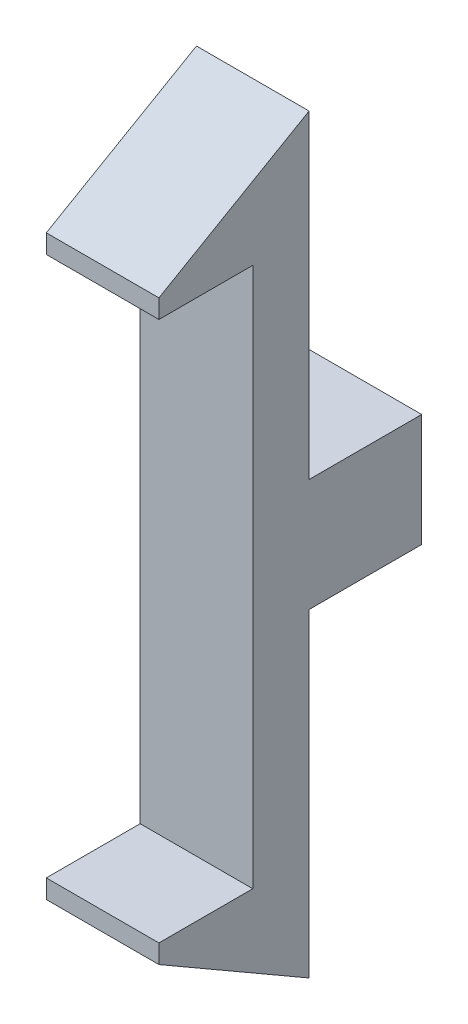
ISO-10303-21;
HEADER;
FILE_DESCRIPTION(('STEP AP214'),'2;1');
FILE_NAME('part.step','',(''),(''),'','','');
FILE_SCHEMA(('AUTOMOTIVE_DESIGN { 1 0 10303 214 1 1 1 1 }'));
ENDSEC;
DATA;
#1=APPLICATION_CONTEXT('core data for automotive mechanical design processes');
#2=APPLICATION_PROTOCOL_DEFINITION('international standard','automotive_design',2000,#1);
#3=PRODUCT_CONTEXT('',#1,'mechanical');
#4=PRODUCT('Part','Part','',(#3));
#5=PRODUCT_RELATED_PRODUCT_CATEGORY('part','',(#4));
#6=PRODUCT_DEFINITION_FORMATION('','',#4);
#7=PRODUCT_DEFINITION_CONTEXT('part definition',#1,'design');
#8=PRODUCT_DEFINITION('design','',#6,#7);
#9=PRODUCT_DEFINITION_SHAPE('','',#8);
#10=(LENGTH_UNIT() NAMED_UNIT(*) SI_UNIT(.MILLI.,.METRE.));
#11=(NAMED_UNIT(*) PLANE_ANGLE_UNIT() SI_UNIT($,.RADIAN.));
#12=(NAMED_UNIT(*) SI_UNIT($,.STERADIAN.) SOLID_ANGLE_UNIT());
#13=UNCERTAINTY_MEASURE_WITH_UNIT(LENGTH_MEASURE(1.E-05),#10,'distance_accuracy_value','');
#14=(GEOMETRIC_REPRESENTATION_CONTEXT(3) GLOBAL_UNCERTAINTY_ASSIGNED_CONTEXT((#13)) GLOBAL_UNIT_ASSIGNED_CONTEXT((#10,
#11,#12)) REPRESENTATION_CONTEXT('',''));
#15=CARTESIAN_POINT('',(0.,0.,0.));
#16=DIRECTION('',(0.,0.,1.));
#17=DIRECTION('',(1.,0.,0.));
#18=AXIS2_PLACEMENT_3D('',#15,#16,#17);
#19=CARTESIAN_POINT('',(-15.,-15.,30.));
#20=DIRECTION('',(1.,0.,0.));
#21=DIRECTION('',(0.,0.,-1.));
#22=AXIS2_PLACEMENT_3D('',#19,#20,#21);
#23=PLANE('',#22);
#24=DIRECTION('',(0.,0.,-1.));
#25=VECTOR('',#24,1.);
#26=CARTESIAN_POINT('',(-15.,-15.,30.));
#27=LINE('',#26,#25);
#28=CARTESIAN_POINT('',(-15.,-15.,30.));
#29=VERTEX_POINT('',#28);
#30=CARTESIAN_POINT('',(-15.,-15.,0.));
#31=VERTEX_POINT('',#30);
#32=EDGE_CURVE('E11',#29,#31,#27,.T.);
#33=ORIENTED_EDGE('',*,*,#32,.F.);
#34=DIRECTION('',(0.,-1.,0.));
#35=VECTOR('',#34,1.);
#36=CARTESIAN_POINT('',(-15.,-15.,30.));
#37=LINE('',#36,#35);
#38=CARTESIAN_POINT('',(-15.,-100.,30.));
#39=VERTEX_POINT('',#38);
#40=EDGE_CURVE('E137',#29,#39,#37,.T.);
#41=ORIENTED_EDGE('',*,*,#40,.T.);
#42=DIRECTION('',(0.,0.499999999999998,0.86602540378444));
#43=VECTOR('',#42,1.);
#44=CARTESIAN_POINT('',(-15.,-76.9059892324151,70.));
#45=LINE('',#44,#43);
#46=CARTESIAN_POINT('',(-15.,-76.9059892324151,70.));
#47=VERTEX_POINT('',#46);
#48=EDGE_CURVE('E145',#39,#47,#45,.T.);
#49=ORIENTED_EDGE('',*,*,#48,.T.);
#50=DIRECTION('',(0.,1.,0.));
#51=VECTOR('',#50,1.);
#52=CARTESIAN_POINT('',(-15.,-71.9059892324151,70.));
#53=LINE('',#52,#51);
#54=CARTESIAN_POINT('',(-15.,-71.9059892324151,70.));
#55=VERTEX_POINT('',#54);
#56=EDGE_CURVE('E158',#47,#55,#53,.T.);
#57=ORIENTED_EDGE('',*,*,#56,.T.);
#58=DIRECTION('',(0.,0.,-1.));
#59=VECTOR('',#58,1.);
#60=CARTESIAN_POINT('',(-15.,-71.9059892324151,70.));
#61=LINE('',#60,#59);
#62=CARTESIAN_POINT('',(-15.,-71.9059892324151,45.));
#63=VERTEX_POINT('',#62);
#64=EDGE_CURVE('E154',#55,#63,#61,.T.);
#65=ORIENTED_EDGE('',*,*,#64,.T.);
#66=DIRECTION('',(0.,-1.,0.));
#67=VECTOR('',#66,1.);
#68=CARTESIAN_POINT('',(-15.,71.9059892324151,45.));
#69=LINE('',#68,#67);
#70=CARTESIAN_POINT('',(-15.,71.9059892324151,45.));
#71=VERTEX_POINT('',#70);
#72=EDGE_CURVE('E184',#71,#63,#69,.T.);
#73=ORIENTED_EDGE('',*,*,#72,.F.);
#74=DIRECTION('',(0.,0.,-1.));
#75=VECTOR('',#74,1.);
#76=CARTESIAN_POINT('',(-15.,71.9059892324151,70.));
#77=LINE('',#76,#75);
#78=CARTESIAN_POINT('',(-15.,71.9059892324151,70.));
#79=VERTEX_POINT('',#78);
#80=EDGE_CURVE('E211',#79,#71,#77,.T.);
#81=ORIENTED_EDGE('',*,*,#80,.F.);
#82=DIRECTION('',(0.,-1.,0.));
#83=VECTOR('',#82,1.);
#84=CARTESIAN_POINT('',(-15.,71.9059892324151,70.));
#85=LINE('',#84,#83);
#86=CARTESIAN_POINT('',(-15.,76.9059892324151,70.));
#87=VERTEX_POINT('',#86);
#88=EDGE_CURVE('E207',#87,#79,#85,.T.);
#89=ORIENTED_EDGE('',*,*,#88,.F.);
#90=DIRECTION('',(0.,-0.499999999999998,0.86602540378444));
#91=VECTOR('',#90,1.);
#92=CARTESIAN_POINT('',(-15.,76.9059892324151,70.));
#93=LINE('',#92,#91);
#94=CARTESIAN_POINT('',(-15.,100.,30.));
#95=VERTEX_POINT('',#94);
#96=EDGE_CURVE('E203',#95,#87,#93,.T.);
#97=ORIENTED_EDGE('',*,*,#96,.F.);
#98=DIRECTION('',(0.,1.,0.));
#99=VECTOR('',#98,1.);
#100=CARTESIAN_POINT('',(-15.,15.,30.));
#101=LINE('',#100,#99);
#102=CARTESIAN_POINT('',(-15.,15.,30.));
#103=VERTEX_POINT('',#102);
#104=EDGE_CURVE('E101',#103,#95,#101,.T.);
#105=ORIENTED_EDGE('',*,*,#104,.F.);
#106=DIRECTION('',(0.,0.,-1.));
#107=VECTOR('',#106,1.);
#108=CARTESIAN_POINT('',(-15.,15.,30.));
#109=LINE('',#108,#107);
#110=CARTESIAN_POINT('',(-15.,15.,0.));
#111=VERTEX_POINT('',#110);
#112=EDGE_CURVE('E87',#103,#111,#109,.T.);
#113=ORIENTED_EDGE('',*,*,#112,.T.);
#114=DIRECTION('',(0.,-1.,0.));
#115=VECTOR('',#114,1.);
#116=CARTESIAN_POINT('',(-15.,-15.,0.));
#117=LINE('',#116,#115);
#118=EDGE_CURVE('E98',#111,#31,#117,.T.);
#119=ORIENTED_EDGE('',*,*,#118,.T.);
#120=EDGE_LOOP('',(#33,#41,#49,#57,#65,#73,#81,#89,#97,#105,#113,#119));
#121=FACE_BOUND('',#120,.T.);
#122=ADVANCED_FACE('F45',(#121),#23,.F.);
#123=CARTESIAN_POINT('',(15.,-15.,30.));
#124=DIRECTION('',(0.,1.,0.));
#125=DIRECTION('',(-1.,0.,0.));
#126=AXIS2_PLACEMENT_3D('',#123,#124,#125);
#127=PLANE('',#126);
#128=DIRECTION('',(1.,0.,0.));
#129=VECTOR('',#128,1.);
#130=CARTESIAN_POINT('',(15.,-15.,0.));
#131=LINE('',#130,#129);
#132=CARTESIAN_POINT('',(15.,-15.,0.));
#133=VERTEX_POINT('',#132);
#134=EDGE_CURVE('E106',#31,#133,#131,.T.);
#135=ORIENTED_EDGE('',*,*,#134,.T.);
#136=DIRECTION('',(0.,0.,-1.));
#137=VECTOR('',#136,1.);
#138=CARTESIAN_POINT('',(15.,-15.,30.));
#139=LINE('',#138,#137);
#140=CARTESIAN_POINT('',(15.,-15.,30.));
#141=VERTEX_POINT('',#140);
#142=EDGE_CURVE('E54',#141,#133,#139,.T.);
#143=ORIENTED_EDGE('',*,*,#142,.F.);
#144=DIRECTION('',(1.,0.,0.));
#145=VECTOR('',#144,1.);
#146=CARTESIAN_POINT('',(15.,-15.,30.));
#147=LINE('',#146,#145);
#148=EDGE_CURVE('E92',#29,#141,#147,.T.);
#149=ORIENTED_EDGE('',*,*,#148,.F.);
#150=ORIENTED_EDGE('',*,*,#32,.T.);
#151=EDGE_LOOP('',(#135,#143,#149,#150));
#152=FACE_BOUND('',#151,.T.);
#153=ADVANCED_FACE('F287',(#152),#127,.F.);
#154=CARTESIAN_POINT('',(15.,-15.,30.));
#155=DIRECTION('',(-1.,0.,0.));
#156=DIRECTION('',(0.,0.,1.));
#157=AXIS2_PLACEMENT_3D('',#154,#155,#156);
#158=PLANE('',#157);
#159=DIRECTION('',(0.,1.,0.));
#160=VECTOR('',#159,1.);
#161=CARTESIAN_POINT('',(15.,-15.,0.));
#162=LINE('',#161,#160);
#163=CARTESIAN_POINT('',(15.,15.,0.));
#164=VERTEX_POINT('',#163);
#165=EDGE_CURVE('E76',#133,#164,#162,.T.);
#166=ORIENTED_EDGE('',*,*,#165,.T.);
#167=DIRECTION('',(0.,0.,-1.));
#168=VECTOR('',#167,1.);
#169=CARTESIAN_POINT('',(15.,15.,30.));
#170=LINE('',#169,#168);
#171=CARTESIAN_POINT('',(15.,15.,30.));
#172=VERTEX_POINT('',#171);
#173=EDGE_CURVE('E88',#172,#164,#170,.T.);
#174=ORIENTED_EDGE('',*,*,#173,.F.);
#175=DIRECTION('',(0.,1.,0.));
#176=VECTOR('',#175,1.);
#177=CARTESIAN_POINT('',(15.,15.,30.));
#178=LINE('',#177,#176);
#179=CARTESIAN_POINT('',(15.,100.,30.));
#180=VERTEX_POINT('',#179);
#181=EDGE_CURVE('E179',#172,#180,#178,.T.);
#182=ORIENTED_EDGE('',*,*,#181,.T.);
#183=DIRECTION('',(0.,-0.499999999999998,0.86602540378444));
#184=VECTOR('',#183,1.);
#185=CARTESIAN_POINT('',(15.,76.9059892324151,70.));
#186=LINE('',#185,#184);
#187=CARTESIAN_POINT('',(15.,76.9059892324151,70.));
#188=VERTEX_POINT('',#187);
#189=EDGE_CURVE('E183',#180,#188,#186,.T.);
#190=ORIENTED_EDGE('',*,*,#189,.T.);
#191=DIRECTION('',(0.,-1.,0.));
#192=VECTOR('',#191,1.);
#193=CARTESIAN_POINT('',(15.,71.9059892324151,70.));
#194=LINE('',#193,#192);
#195=CARTESIAN_POINT('',(15.,71.9059892324151,70.));
#196=VERTEX_POINT('',#195);
#197=EDGE_CURVE('E188',#188,#196,#194,.T.);
#198=ORIENTED_EDGE('',*,*,#197,.T.);
#199=DIRECTION('',(0.,0.,-1.));
#200=VECTOR('',#199,1.);
#201=CARTESIAN_POINT('',(15.,71.9059892324151,70.));
#202=LINE('',#201,#200);
#203=CARTESIAN_POINT('',(15.,71.9059892324151,45.));
#204=VERTEX_POINT('',#203);
#205=EDGE_CURVE('E192',#196,#204,#202,.T.);
#206=ORIENTED_EDGE('',*,*,#205,.T.);
#207=DIRECTION('',(0.,-1.,0.));
#208=VECTOR('',#207,1.);
#209=CARTESIAN_POINT('',(15.,71.9059892324151,45.));
#210=LINE('',#209,#208);
#211=CARTESIAN_POINT('',(15.,-71.9059892324151,45.));
#212=VERTEX_POINT('',#211);
#213=EDGE_CURVE('E196',#204,#212,#210,.T.);
#214=ORIENTED_EDGE('',*,*,#213,.T.);
#215=DIRECTION('',(0.,0.,-1.));
#216=VECTOR('',#215,1.);
#217=CARTESIAN_POINT('',(15.,-71.9059892324151,70.));
#218=LINE('',#217,#216);
#219=CARTESIAN_POINT('',(15.,-71.9059892324151,70.));
#220=VERTEX_POINT('',#219);
#221=EDGE_CURVE('E136',#220,#212,#218,.T.);
#222=ORIENTED_EDGE('',*,*,#221,.F.);
#223=DIRECTION('',(0.,1.,0.));
#224=VECTOR('',#223,1.);
#225=CARTESIAN_POINT('',(15.,-71.9059892324151,70.));
#226=LINE('',#225,#224);
#227=CARTESIAN_POINT('',(15.,-76.9059892324151,70.));
#228=VERTEX_POINT('',#227);
#229=EDGE_CURVE('E142',#228,#220,#226,.T.);
#230=ORIENTED_EDGE('',*,*,#229,.F.);
#231=DIRECTION('',(0.,0.499999999999998,0.86602540378444));
#232=VECTOR('',#231,1.);
#233=CARTESIAN_POINT('',(15.,-76.9059892324151,70.));
#234=LINE('',#233,#232);
#235=CARTESIAN_POINT('',(15.,-100.,30.));
#236=VERTEX_POINT('',#235);
#237=EDGE_CURVE('E131',#236,#228,#234,.T.);
#238=ORIENTED_EDGE('',*,*,#237,.F.);
#239=DIRECTION('',(0.,-1.,0.));
#240=VECTOR('',#239,1.);
#241=CARTESIAN_POINT('',(15.,-15.,30.));
#242=LINE('',#241,#240);
#243=EDGE_CURVE('E127',#141,#236,#242,.T.);
#244=ORIENTED_EDGE('',*,*,#243,.F.);
#245=ORIENTED_EDGE('',*,*,#142,.T.);
#246=EDGE_LOOP('',(#166,#174,#182,#190,#198,#206,#214,#222,#230,#238,#244,#245));
#247=FACE_BOUND('',#246,.T.);
#248=ADVANCED_FACE('F124',(#247),#158,.F.);
#249=CARTESIAN_POINT('',(15.,15.,30.));
#250=DIRECTION('',(0.,-1.,0.));
#251=DIRECTION('',(1.,0.,0.));
#252=AXIS2_PLACEMENT_3D('',#249,#250,#251);
#253=PLANE('',#252);
#254=DIRECTION('',(-1.,0.,0.));
#255=VECTOR('',#254,1.);
#256=CARTESIAN_POINT('',(15.,15.,0.));
#257=LINE('',#256,#255);
#258=EDGE_CURVE('E82',#164,#111,#257,.T.);
#259=ORIENTED_EDGE('',*,*,#258,.T.);
#260=ORIENTED_EDGE('',*,*,#112,.F.);
#261=DIRECTION('',(-1.,0.,0.));
#262=VECTOR('',#261,1.);
#263=CARTESIAN_POINT('',(15.,15.,30.));
#264=LINE('',#263,#262);
#265=EDGE_CURVE('E103',#172,#103,#264,.T.);
#266=ORIENTED_EDGE('',*,*,#265,.F.);
#267=ORIENTED_EDGE('',*,*,#173,.T.);
#268=EDGE_LOOP('',(#259,#260,#266,#267));
#269=FACE_BOUND('',#268,.T.);
#270=ADVANCED_FACE('F84',(#269),#253,.F.);
#271=CARTESIAN_POINT('',(0.,0.,0.));
#272=DIRECTION('',(0.,0.,1.));
#273=DIRECTION('',(1.,0.,0.));
#274=AXIS2_PLACEMENT_3D('',#271,#272,#273);
#275=PLANE('',#274);
#276=ORIENTED_EDGE('',*,*,#118,.F.);
#277=ORIENTED_EDGE('',*,*,#258,.F.);
#278=ORIENTED_EDGE('',*,*,#165,.F.);
#279=ORIENTED_EDGE('',*,*,#134,.F.);
#280=EDGE_LOOP('',(#276,#277,#278,#279));
#281=FACE_BOUND('',#280,.T.);
#282=ADVANCED_FACE('F105',(#281),#275,.F.);
#283=CARTESIAN_POINT('',(15.,15.,30.));
#284=DIRECTION('',(0.,0.,1.));
#285=DIRECTION('',(1.,0.,0.));
#286=AXIS2_PLACEMENT_3D('',#283,#284,#285);
#287=PLANE('',#286);
#288=ORIENTED_EDGE('',*,*,#181,.F.);
#289=ORIENTED_EDGE('',*,*,#265,.T.);
#290=ORIENTED_EDGE('',*,*,#104,.T.);
#291=DIRECTION('',(-1.,0.,0.));
#292=VECTOR('',#291,1.);
#293=CARTESIAN_POINT('',(15.,100.,30.));
#294=LINE('',#293,#292);
#295=EDGE_CURVE('E108',#180,#95,#294,.T.);
#296=ORIENTED_EDGE('',*,*,#295,.F.);
#297=EDGE_LOOP('',(#288,#289,#290,#296));
#298=FACE_BOUND('',#297,.T.);
#299=ADVANCED_FACE('F233',(#298),#287,.F.);
#300=CARTESIAN_POINT('',(15.,76.9059892324151,70.));
#301=DIRECTION('',(0.,-0.86602540378444,-0.499999999999998));
#302=DIRECTION('',(0.,0.499999999999998,-0.86602540378444));
#303=AXIS2_PLACEMENT_3D('',#300,#301,#302);
#304=PLANE('',#303);
#305=ORIENTED_EDGE('',*,*,#96,.T.);
#306=DIRECTION('',(-1.,0.,0.));
#307=VECTOR('',#306,1.);
#308=CARTESIAN_POINT('',(15.,76.9059892324151,70.));
#309=LINE('',#308,#307);
#310=EDGE_CURVE('E114',#188,#87,#309,.T.);
#311=ORIENTED_EDGE('',*,*,#310,.F.);
#312=ORIENTED_EDGE('',*,*,#189,.F.);
#313=ORIENTED_EDGE('',*,*,#295,.T.);
#314=EDGE_LOOP('',(#305,#311,#312,#313));
#315=FACE_BOUND('',#314,.T.);
#316=ADVANCED_FACE('F301',(#315),#304,.F.);
#317=CARTESIAN_POINT('',(15.,71.9059892324151,70.));
#318=DIRECTION('',(0.,0.,-1.));
#319=DIRECTION('',(0.,1.,0.));
#320=AXIS2_PLACEMENT_3D('',#317,#318,#319);
#321=PLANE('',#320);
#322=ORIENTED_EDGE('',*,*,#88,.T.);
#323=DIRECTION('',(-1.,0.,0.));
#324=VECTOR('',#323,1.);
#325=CARTESIAN_POINT('',(15.,71.9059892324151,70.));
#326=LINE('',#325,#324);
#327=EDGE_CURVE('E221',#196,#79,#326,.T.);
#328=ORIENTED_EDGE('',*,*,#327,.F.);
#329=ORIENTED_EDGE('',*,*,#197,.F.);
#330=ORIENTED_EDGE('',*,*,#310,.T.);
#331=EDGE_LOOP('',(#322,#328,#329,#330));
#332=FACE_BOUND('',#331,.T.);
#333=ADVANCED_FACE('F304',(#332),#321,.F.);
#334=CARTESIAN_POINT('',(15.,71.9059892324151,70.));
#335=DIRECTION('',(0.,1.,0.));
#336=DIRECTION('',(0.,0.,1.));
#337=AXIS2_PLACEMENT_3D('',#334,#335,#336);
#338=PLANE('',#337);
#339=ORIENTED_EDGE('',*,*,#80,.T.);
#340=DIRECTION('',(-1.,0.,0.));
#341=VECTOR('',#340,1.);
#342=CARTESIAN_POINT('',(15.,71.9059892324151,45.));
#343=LINE('',#342,#341);
#344=EDGE_CURVE('E200',#204,#71,#343,.T.);
#345=ORIENTED_EDGE('',*,*,#344,.F.);
#346=ORIENTED_EDGE('',*,*,#205,.F.);
#347=ORIENTED_EDGE('',*,*,#327,.T.);
#348=EDGE_LOOP('',(#339,#345,#346,#347));
#349=FACE_BOUND('',#348,.T.);
#350=ADVANCED_FACE('F308',(#349),#338,.F.);
#351=CARTESIAN_POINT('',(15.,71.9059892324151,45.));
#352=DIRECTION('',(0.,0.,-1.));
#353=DIRECTION('',(0.,1.,0.));
#354=AXIS2_PLACEMENT_3D('',#351,#352,#353);
#355=PLANE('',#354);
#356=ORIENTED_EDGE('',*,*,#72,.T.);
#357=DIRECTION('',(-1.,0.,0.));
#358=VECTOR('',#357,1.);
#359=CARTESIAN_POINT('',(15.,-71.9059892324151,45.));
#360=LINE('',#359,#358);
#361=EDGE_CURVE('E175',#212,#63,#360,.T.);
#362=ORIENTED_EDGE('',*,*,#361,.F.);
#363=ORIENTED_EDGE('',*,*,#213,.F.);
#364=ORIENTED_EDGE('',*,*,#344,.T.);
#365=EDGE_LOOP('',(#356,#362,#363,#364));
#366=FACE_BOUND('',#365,.T.);
#367=ADVANCED_FACE('F275',(#366),#355,.F.);
#368=CARTESIAN_POINT('',(15.,-15.,30.));
#369=DIRECTION('',(0.,0.,-1.));
#370=DIRECTION('',(-1.,0.,0.));
#371=AXIS2_PLACEMENT_3D('',#368,#369,#370);
#372=PLANE('',#371);
#373=ORIENTED_EDGE('',*,*,#148,.T.);
#374=ORIENTED_EDGE('',*,*,#243,.T.);
#375=DIRECTION('',(-1.,0.,0.));
#376=VECTOR('',#375,1.);
#377=CARTESIAN_POINT('',(15.,-100.,30.));
#378=LINE('',#377,#376);
#379=EDGE_CURVE('E153',#236,#39,#378,.T.);
#380=ORIENTED_EDGE('',*,*,#379,.T.);
#381=ORIENTED_EDGE('',*,*,#40,.F.);
#382=EDGE_LOOP('',(#373,#374,#380,#381));
#383=FACE_BOUND('',#382,.T.);
#384=ADVANCED_FACE('F286',(#383),#372,.T.);
#385=CARTESIAN_POINT('',(15.,-71.9059892324151,70.));
#386=DIRECTION('',(0.,1.,0.));
#387=DIRECTION('',(0.,0.,1.));
#388=AXIS2_PLACEMENT_3D('',#385,#386,#387);
#389=PLANE('',#388);
#390=ORIENTED_EDGE('',*,*,#64,.F.);
#391=DIRECTION('',(-1.,0.,0.));
#392=VECTOR('',#391,1.);
#393=CARTESIAN_POINT('',(15.,-71.9059892324151,70.));
#394=LINE('',#393,#392);
#395=EDGE_CURVE('E171',#220,#55,#394,.T.);
#396=ORIENTED_EDGE('',*,*,#395,.F.);
#397=ORIENTED_EDGE('',*,*,#221,.T.);
#398=ORIENTED_EDGE('',*,*,#361,.T.);
#399=EDGE_LOOP('',(#390,#396,#397,#398));
#400=FACE_BOUND('',#399,.T.);
#401=ADVANCED_FACE('F279',(#400),#389,.T.);
#402=CARTESIAN_POINT('',(15.,-71.9059892324151,70.));
#403=DIRECTION('',(0.,0.,1.));
#404=DIRECTION('',(0.,-1.,0.));
#405=AXIS2_PLACEMENT_3D('',#402,#403,#404);
#406=PLANE('',#405);
#407=ORIENTED_EDGE('',*,*,#56,.F.);
#408=DIRECTION('',(-1.,0.,0.));
#409=VECTOR('',#408,1.);
#410=CARTESIAN_POINT('',(15.,-76.9059892324151,70.));
#411=LINE('',#410,#409);
#412=EDGE_CURVE('E167',#228,#47,#411,.T.);
#413=ORIENTED_EDGE('',*,*,#412,.F.);
#414=ORIENTED_EDGE('',*,*,#229,.T.);
#415=ORIENTED_EDGE('',*,*,#395,.T.);
#416=EDGE_LOOP('',(#407,#413,#414,#415));
#417=FACE_BOUND('',#416,.T.);
#418=ADVANCED_FACE('F282',(#417),#406,.T.);
#419=CARTESIAN_POINT('',(15.,-76.9059892324151,70.));
#420=DIRECTION('',(0.,-0.86602540378444,0.499999999999998));
#421=DIRECTION('',(0.,-0.499999999999998,-0.86602540378444));
#422=AXIS2_PLACEMENT_3D('',#419,#420,#421);
#423=PLANE('',#422);
#424=ORIENTED_EDGE('',*,*,#48,.F.);
#425=ORIENTED_EDGE('',*,*,#379,.F.);
#426=ORIENTED_EDGE('',*,*,#237,.T.);
#427=ORIENTED_EDGE('',*,*,#412,.T.);
#428=EDGE_LOOP('',(#424,#425,#426,#427));
#429=FACE_BOUND('',#428,.T.);
#430=ADVANCED_FACE('F285',(#429),#423,.T.);
#431=CLOSED_SHELL('',(#122,#153,#248,#270,#282,#299,#316,#333,#350,#367,#384,#401,#418,#430));
#432=MANIFOLD_SOLID_BREP('B2',#431);
#433=ADVANCED_BREP_SHAPE_REPRESENTATION('',(#18,#432),#14);
#434=SHAPE_DEFINITION_REPRESENTATION(#9,#433);
ENDSEC;
END-ISO-10303-21;
